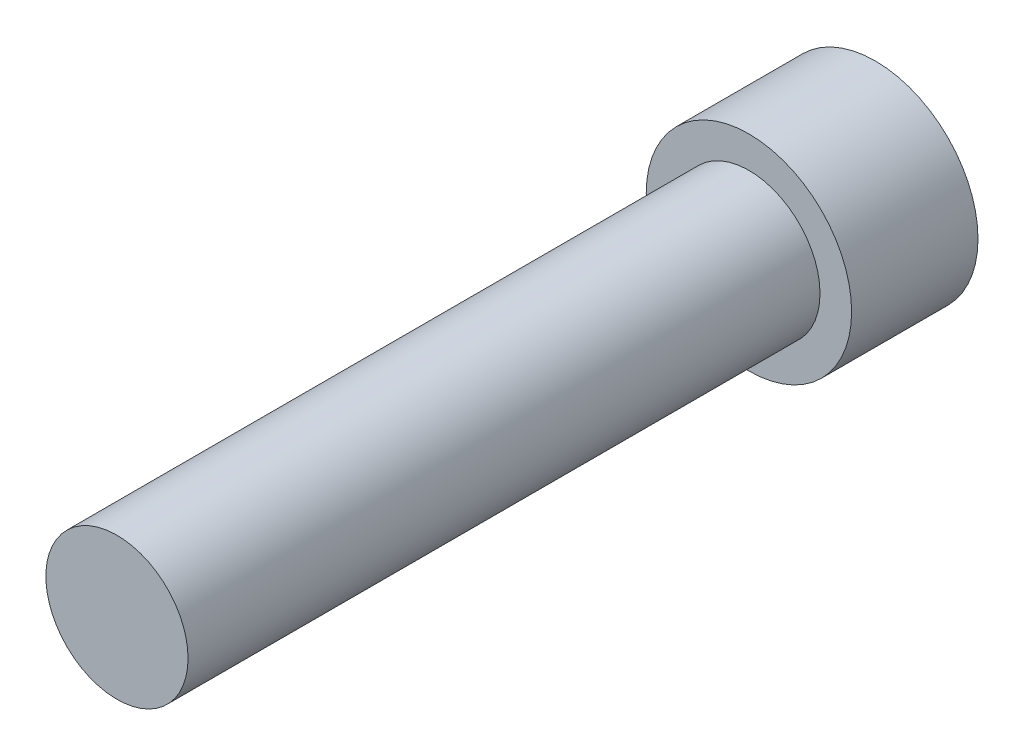
ISO-10303-21;
HEADER;
FILE_DESCRIPTION(('STEP AP214'),'2;1');
FILE_NAME('part.step','',(''),(''),'','','');
FILE_SCHEMA(('AUTOMOTIVE_DESIGN { 1 0 10303 214 1 1 1 1 }'));
ENDSEC;
DATA;
#1=APPLICATION_CONTEXT('core data for automotive mechanical design processes');
#2=APPLICATION_PROTOCOL_DEFINITION('international standard','automotive_design',2000,#1);
#3=PRODUCT_CONTEXT('',#1,'mechanical');
#4=PRODUCT('Part','Part','',(#3));
#5=PRODUCT_RELATED_PRODUCT_CATEGORY('part','',(#4));
#6=PRODUCT_DEFINITION_FORMATION('','',#4);
#7=PRODUCT_DEFINITION_CONTEXT('part definition',#1,'design');
#8=PRODUCT_DEFINITION('design','',#6,#7);
#9=PRODUCT_DEFINITION_SHAPE('','',#8);
#10=(LENGTH_UNIT() NAMED_UNIT(*) SI_UNIT(.MILLI.,.METRE.));
#11=(NAMED_UNIT(*) PLANE_ANGLE_UNIT() SI_UNIT($,.RADIAN.));
#12=(NAMED_UNIT(*) SI_UNIT($,.STERADIAN.) SOLID_ANGLE_UNIT());
#13=UNCERTAINTY_MEASURE_WITH_UNIT(LENGTH_MEASURE(1.E-05),#10,'distance_accuracy_value','');
#14=(GEOMETRIC_REPRESENTATION_CONTEXT(3) GLOBAL_UNCERTAINTY_ASSIGNED_CONTEXT((#13)) GLOBAL_UNIT_ASSIGNED_CONTEXT((#10,
#11,#12)) REPRESENTATION_CONTEXT('',''));
#15=CARTESIAN_POINT('',(0.,0.,0.));
#16=DIRECTION('',(0.,0.,1.));
#17=DIRECTION('',(1.,0.,0.));
#18=AXIS2_PLACEMENT_3D('',#15,#16,#17);
#19=CARTESIAN_POINT('',(0.,0.,40.));
#20=DIRECTION('',(0.,0.,-1.));
#21=DIRECTION('',(-1.,0.,0.));
#22=AXIS2_PLACEMENT_3D('',#19,#20,#21);
#23=CYLINDRICAL_SURFACE('',#22,4.5);
#24=CARTESIAN_POINT('',(0.,0.,40.));
#25=DIRECTION('',(0.,0.,1.));
#26=DIRECTION('',(1.,0.,0.));
#27=AXIS2_PLACEMENT_3D('',#24,#25,#26);
#28=CIRCLE('',#27,4.5);
#29=CARTESIAN_POINT('',(4.5,0.,40.));
#30=VERTEX_POINT('',#29);
#31=EDGE_CURVE('E11',#30,#30,#28,.T.);
#32=ORIENTED_EDGE('',*,*,#31,.F.);
#33=EDGE_LOOP('',(#32));
#34=FACE_BOUND('',#33,.T.);
#35=CARTESIAN_POINT('',(0.,0.,0.));
#36=DIRECTION('',(0.,0.,1.));
#37=DIRECTION('',(1.,0.,0.));
#38=AXIS2_PLACEMENT_3D('',#35,#36,#37);
#39=CIRCLE('',#38,4.5);
#40=CARTESIAN_POINT('',(4.5,0.,0.));
#41=VERTEX_POINT('',#40);
#42=EDGE_CURVE('E48',#41,#41,#39,.T.);
#43=ORIENTED_EDGE('',*,*,#42,.T.);
#44=EDGE_LOOP('',(#43));
#45=FACE_BOUND('',#44,.T.);
#46=ADVANCED_FACE('F45',(#34,#45),#23,.T.);
#47=CARTESIAN_POINT('',(0.,0.,40.));
#48=DIRECTION('',(0.,0.,1.));
#49=DIRECTION('',(1.,0.,0.));
#50=AXIS2_PLACEMENT_3D('',#47,#48,#49);
#51=PLANE('',#50);
#52=ORIENTED_EDGE('',*,*,#31,.T.);
#53=EDGE_LOOP('',(#52));
#54=FACE_BOUND('',#53,.T.);
#55=ADVANCED_FACE('F243',(#54),#51,.T.);
#56=CARTESIAN_POINT('',(0.,0.,-8.));
#57=DIRECTION('',(0.,0.,1.));
#58=DIRECTION('',(1.,0.,0.));
#59=AXIS2_PLACEMENT_3D('',#56,#57,#58);
#60=CYLINDRICAL_SURFACE('',#59,6.5);
#61=CARTESIAN_POINT('',(0.,0.,-8.));
#62=DIRECTION('',(0.,0.,-1.));
#63=DIRECTION('',(-1.,0.,0.));
#64=AXIS2_PLACEMENT_3D('',#61,#62,#63);
#65=CIRCLE('',#64,6.5);
#66=CARTESIAN_POINT('',(-6.5,0.,-8.));
#67=VERTEX_POINT('',#66);
#68=EDGE_CURVE('E218',#67,#67,#65,.T.);
#69=ORIENTED_EDGE('',*,*,#68,.F.);
#70=EDGE_LOOP('',(#69));
#71=FACE_BOUND('',#70,.T.);
#72=CARTESIAN_POINT('',(0.,0.,0.));
#73=DIRECTION('',(0.,0.,-1.));
#74=DIRECTION('',(-1.,0.,0.));
#75=AXIS2_PLACEMENT_3D('',#72,#73,#74);
#76=CIRCLE('',#75,6.5);
#77=CARTESIAN_POINT('',(-6.5,0.,0.));
#78=VERTEX_POINT('',#77);
#79=EDGE_CURVE('E200',#78,#78,#76,.T.);
#80=ORIENTED_EDGE('',*,*,#79,.T.);
#81=EDGE_LOOP('',(#80));
#82=FACE_BOUND('',#81,.T.);
#83=ADVANCED_FACE('F224',(#71,#82),#60,.T.);
#84=CARTESIAN_POINT('',(0.,0.,-8.));
#85=DIRECTION('',(0.,0.,-1.));
#86=DIRECTION('',(-1.,0.,0.));
#87=AXIS2_PLACEMENT_3D('',#84,#85,#86);
#88=PLANE('',#87);
#89=CARTESIAN_POINT('',(1.09157532982501,2.03514044543632,-8.));
#90=DIRECTION('',(0.,0.,-1.));
#91=DIRECTION('',(-1.,0.,0.));
#92=AXIS2_PLACEMENT_3D('',#89,#90,#91);
#93=CIRCLE('',#92,0.5);
#94=CARTESIAN_POINT('',(1.07593528841507,2.53489577467724,-8.));
#95=VERTEX_POINT('',#94);
#96=CARTESIAN_POINT('',(1.51655611991933,2.29856278323403,-8.));
#97=VERTEX_POINT('',#96);
#98=EDGE_CURVE('E59',#95,#97,#93,.T.);
#99=ORIENTED_EDGE('',*,*,#98,.F.);
#100=DIRECTION('',(0.99951065848183,0.0312800828198786,0.));
#101=VECTOR('',#100,1.);
#102=CARTESIAN_POINT('',(-1.23233570251446,2.46265751773191,-8.));
#103=LINE('',#102,#101);
#104=CARTESIAN_POINT('',(-1.23233570251446,2.46265751773191,-8.));
#105=VERTEX_POINT('',#104);
#106=EDGE_CURVE('E196',#105,#95,#103,.T.);
#107=ORIENTED_EDGE('',*,*,#106,.F.);
#108=CARTESIAN_POINT('',(-1.21669566110453,1.962902188491,-8.));
#109=DIRECTION('',(0.,0.,-1.));
#110=DIRECTION('',(-1.,0.,0.));
#111=AXIS2_PLACEMENT_3D('',#108,#109,#110);
#112=CIRCLE('',#111,0.5);
#113=CARTESIAN_POINT('',(-1.65731649260879,2.19923517993421,-8.));
#114=VERTEX_POINT('',#113);
#115=EDGE_CURVE('E194',#114,#105,#112,.T.);
#116=ORIENTED_EDGE('',*,*,#115,.F.);
#117=DIRECTION('',(0.472665982886419,0.881241663008516,0.));
#118=VECTOR('',#117,1.);
#119=CARTESIAN_POINT('',(-2.7488918224338,0.164094734497888,-8.));
#120=LINE('',#119,#118);
#121=CARTESIAN_POINT('',(-2.7488918224338,0.164094734497888,-8.));
#122=VERTEX_POINT('',#121);
#123=EDGE_CURVE('E143',#122,#114,#120,.T.);
#124=ORIENTED_EDGE('',*,*,#123,.F.);
#125=CARTESIAN_POINT('',(-2.30827099092954,-0.0722382569453232,-8.));
#126=DIRECTION('',(0.,0.,-1.));
#127=DIRECTION('',(-1.,0.,0.));
#128=AXIS2_PLACEMENT_3D('',#125,#126,#127);
#129=CIRCLE('',#128,0.5);
#130=CARTESIAN_POINT('',(-2.73325178102386,-0.335660594743031,-8.));
#131=VERTEX_POINT('',#130);
#132=EDGE_CURVE('E190',#131,#122,#129,.T.);
#133=ORIENTED_EDGE('',*,*,#132,.F.);
#134=DIRECTION('',(-0.526844675595411,0.849961580188638,0.));
#135=VECTOR('',#134,1.);
#136=CARTESIAN_POINT('',(-1.51655611991933,-2.29856278323403,-8.));
#137=LINE('',#136,#135);
#138=CARTESIAN_POINT('',(-1.51655611991933,-2.29856278323403,-8.));
#139=VERTEX_POINT('',#138);
#140=EDGE_CURVE('E187',#139,#131,#137,.T.);
#141=ORIENTED_EDGE('',*,*,#140,.F.);
#142=CARTESIAN_POINT('',(-1.09157532982501,-2.03514044543632,-8.));
#143=DIRECTION('',(0.,0.,-1.));
#144=DIRECTION('',(1.,0.,0.));
#145=AXIS2_PLACEMENT_3D('',#142,#143,#144);
#146=CIRCLE('',#145,0.5);
#147=CARTESIAN_POINT('',(-1.07593528841507,-2.53489577467724,-8.));
#148=VERTEX_POINT('',#147);
#149=EDGE_CURVE('E184',#148,#139,#146,.T.);
#150=ORIENTED_EDGE('',*,*,#149,.F.);
#151=DIRECTION('',(-0.99951065848183,-0.0312800828198786,0.));
#152=VECTOR('',#151,1.);
#153=CARTESIAN_POINT('',(1.23233570251446,-2.46265751773191,-8.));
#154=LINE('',#153,#152);
#155=CARTESIAN_POINT('',(1.23233570251446,-2.46265751773191,-8.));
#156=VERTEX_POINT('',#155);
#157=EDGE_CURVE('E181',#156,#148,#154,.T.);
#158=ORIENTED_EDGE('',*,*,#157,.F.);
#159=CARTESIAN_POINT('',(1.21669566110453,-1.962902188491,-8.));
#160=DIRECTION('',(0.,0.,-1.));
#161=DIRECTION('',(-1.,0.,0.));
#162=AXIS2_PLACEMENT_3D('',#159,#160,#161);
#163=CIRCLE('',#162,0.5);
#164=CARTESIAN_POINT('',(1.65731649260879,-2.19923517993421,-8.));
#165=VERTEX_POINT('',#164);
#166=EDGE_CURVE('E178',#165,#156,#163,.T.);
#167=ORIENTED_EDGE('',*,*,#166,.F.);
#168=DIRECTION('',(-0.472665982886419,-0.881241663008516,0.));
#169=VECTOR('',#168,1.);
#170=CARTESIAN_POINT('',(2.7488918224338,-0.164094734497889,-8.));
#171=LINE('',#170,#169);
#172=CARTESIAN_POINT('',(2.7488918224338,-0.164094734497889,-8.));
#173=VERTEX_POINT('',#172);
#174=EDGE_CURVE('E175',#173,#165,#171,.T.);
#175=ORIENTED_EDGE('',*,*,#174,.F.);
#176=CARTESIAN_POINT('',(2.30827099092954,0.0722382569453228,-8.));
#177=DIRECTION('',(0.,0.,-1.));
#178=DIRECTION('',(-1.,0.,0.));
#179=AXIS2_PLACEMENT_3D('',#176,#177,#178);
#180=CIRCLE('',#179,0.5);
#181=CARTESIAN_POINT('',(2.73325178102386,0.33566059474303,-8.));
#182=VERTEX_POINT('',#181);
#183=EDGE_CURVE('E172',#182,#173,#180,.T.);
#184=ORIENTED_EDGE('',*,*,#183,.F.);
#185=DIRECTION('',(0.526844675595411,-0.849961580188638,0.));
#186=VECTOR('',#185,1.);
#187=CARTESIAN_POINT('',(1.51655611991933,2.29856278323403,-8.));
#188=LINE('',#187,#186);
#189=EDGE_CURVE('E169',#97,#182,#188,.T.);
#190=ORIENTED_EDGE('',*,*,#189,.F.);
#191=EDGE_LOOP('',(#99,#107,#116,#124,#133,#141,#150,#158,#167,#175,#184,#190));
#192=FACE_BOUND('',#191,.T.);
#193=ORIENTED_EDGE('',*,*,#68,.T.);
#194=EDGE_LOOP('',(#193));
#195=FACE_BOUND('',#194,.T.);
#196=ADVANCED_FACE('F229',(#192,#195),#88,.T.);
#197=CARTESIAN_POINT('',(0.,0.,0.));
#198=DIRECTION('',(0.,0.,-1.));
#199=DIRECTION('',(-1.,0.,0.));
#200=AXIS2_PLACEMENT_3D('',#197,#198,#199);
#201=PLANE('',#200);
#202=ORIENTED_EDGE('',*,*,#42,.F.);
#203=EDGE_LOOP('',(#202));
#204=FACE_BOUND('',#203,.T.);
#205=ORIENTED_EDGE('',*,*,#79,.F.);
#206=EDGE_LOOP('',(#205));
#207=FACE_BOUND('',#206,.T.);
#208=ADVANCED_FACE('F226',(#204,#207),#201,.F.);
#209=CARTESIAN_POINT('',(1.09157532982501,2.03514044543632,-4.));
#210=DIRECTION('',(0.,0.,-1.));
#211=DIRECTION('',(-1.,0.,0.));
#212=AXIS2_PLACEMENT_3D('',#209,#210,#211);
#213=CYLINDRICAL_SURFACE('',#212,0.5);
#214=ORIENTED_EDGE('',*,*,#98,.T.);
#215=DIRECTION('',(0.,0.,-1.));
#216=VECTOR('',#215,1.);
#217=CARTESIAN_POINT('',(1.51655611991933,2.29856278323403,-4.));
#218=LINE('',#217,#216);
#219=CARTESIAN_POINT('',(1.51655611991933,2.29856278323403,-4.));
#220=VERTEX_POINT('',#219);
#221=EDGE_CURVE('E107',#220,#97,#218,.T.);
#222=ORIENTED_EDGE('',*,*,#221,.F.);
#223=CARTESIAN_POINT('',(1.09157532982501,2.03514044543632,-4.));
#224=DIRECTION('',(0.,0.,-1.));
#225=DIRECTION('',(-1.,0.,0.));
#226=AXIS2_PLACEMENT_3D('',#223,#224,#225);
#227=CIRCLE('',#226,0.5);
#228=CARTESIAN_POINT('',(1.07593528841507,2.53489577467724,-4.));
#229=VERTEX_POINT('',#228);
#230=EDGE_CURVE('E198',#229,#220,#227,.T.);
#231=ORIENTED_EDGE('',*,*,#230,.F.);
#232=DIRECTION('',(0.,0.,-1.));
#233=VECTOR('',#232,1.);
#234=CARTESIAN_POINT('',(1.07593528841507,2.53489577467724,-4.));
#235=LINE('',#234,#233);
#236=EDGE_CURVE('E67',#229,#95,#235,.T.);
#237=ORIENTED_EDGE('',*,*,#236,.T.);
#238=EDGE_LOOP('',(#214,#222,#231,#237));
#239=FACE_BOUND('',#238,.T.);
#240=ADVANCED_FACE('F228',(#239),#213,.F.);
#241=CARTESIAN_POINT('',(-1.23233570251446,2.46265751773191,-4.));
#242=DIRECTION('',(-0.0312800828198786,0.99951065848183,0.));
#243=DIRECTION('',(-0.99951065848183,-0.0312800828198786,0.));
#244=AXIS2_PLACEMENT_3D('',#241,#242,#243);
#245=PLANE('',#244);
#246=ORIENTED_EDGE('',*,*,#106,.T.);
#247=ORIENTED_EDGE('',*,*,#236,.F.);
#248=DIRECTION('',(0.99951065848183,0.0312800828198786,0.));
#249=VECTOR('',#248,1.);
#250=CARTESIAN_POINT('',(-1.23233570251446,2.46265751773191,-4.));
#251=LINE('',#250,#249);
#252=CARTESIAN_POINT('',(-1.23233570251446,2.46265751773191,-4.));
#253=VERTEX_POINT('',#252);
#254=EDGE_CURVE('E155',#253,#229,#251,.T.);
#255=ORIENTED_EDGE('',*,*,#254,.F.);
#256=DIRECTION('',(0.,0.,-1.));
#257=VECTOR('',#256,1.);
#258=CARTESIAN_POINT('',(-1.23233570251446,2.46265751773191,-4.));
#259=LINE('',#258,#257);
#260=EDGE_CURVE('E147',#253,#105,#259,.T.);
#261=ORIENTED_EDGE('',*,*,#260,.T.);
#262=EDGE_LOOP('',(#246,#247,#255,#261));
#263=FACE_BOUND('',#262,.T.);
#264=ADVANCED_FACE('F236',(#263),#245,.F.);
#265=CARTESIAN_POINT('',(-1.21669566110453,1.962902188491,-4.));
#266=DIRECTION('',(0.,0.,-1.));
#267=DIRECTION('',(-1.,0.,0.));
#268=AXIS2_PLACEMENT_3D('',#265,#266,#267);
#269=CYLINDRICAL_SURFACE('',#268,0.5);
#270=ORIENTED_EDGE('',*,*,#115,.T.);
#271=ORIENTED_EDGE('',*,*,#260,.F.);
#272=CARTESIAN_POINT('',(-1.21669566110453,1.962902188491,-4.));
#273=DIRECTION('',(0.,0.,-1.));
#274=DIRECTION('',(-1.,0.,0.));
#275=AXIS2_PLACEMENT_3D('',#272,#273,#274);
#276=CIRCLE('',#275,0.5);
#277=CARTESIAN_POINT('',(-1.65731649260879,2.19923517993421,-4.));
#278=VERTEX_POINT('',#277);
#279=EDGE_CURVE('E151',#278,#253,#276,.T.);
#280=ORIENTED_EDGE('',*,*,#279,.F.);
#281=DIRECTION('',(0.,0.,-1.));
#282=VECTOR('',#281,1.);
#283=CARTESIAN_POINT('',(-1.65731649260879,2.19923517993421,-4.));
#284=LINE('',#283,#282);
#285=EDGE_CURVE('E136',#278,#114,#284,.T.);
#286=ORIENTED_EDGE('',*,*,#285,.T.);
#287=EDGE_LOOP('',(#270,#271,#280,#286));
#288=FACE_BOUND('',#287,.T.);
#289=ADVANCED_FACE('F152',(#288),#269,.F.);
#290=CARTESIAN_POINT('',(-2.7488918224338,0.164094734497888,-4.));
#291=DIRECTION('',(-0.881241663008516,0.472665982886419,0.));
#292=DIRECTION('',(-0.472665982886419,-0.881241663008516,0.));
#293=AXIS2_PLACEMENT_3D('',#290,#291,#292);
#294=PLANE('',#293);
#295=ORIENTED_EDGE('',*,*,#123,.T.);
#296=ORIENTED_EDGE('',*,*,#285,.F.);
#297=DIRECTION('',(0.472665982886419,0.881241663008516,0.));
#298=VECTOR('',#297,1.);
#299=CARTESIAN_POINT('',(-2.7488918224338,0.164094734497888,-4.));
#300=LINE('',#299,#298);
#301=CARTESIAN_POINT('',(-2.7488918224338,0.164094734497888,-4.));
#302=VERTEX_POINT('',#301);
#303=EDGE_CURVE('E140',#302,#278,#300,.T.);
#304=ORIENTED_EDGE('',*,*,#303,.F.);
#305=DIRECTION('',(0.,0.,-1.));
#306=VECTOR('',#305,1.);
#307=CARTESIAN_POINT('',(-2.7488918224338,0.164094734497888,-4.));
#308=LINE('',#307,#306);
#309=EDGE_CURVE('E148',#302,#122,#308,.T.);
#310=ORIENTED_EDGE('',*,*,#309,.T.);
#311=EDGE_LOOP('',(#295,#296,#304,#310));
#312=FACE_BOUND('',#311,.T.);
#313=ADVANCED_FACE('F138',(#312),#294,.F.);
#314=CARTESIAN_POINT('',(-2.30827099092954,-0.0722382569453232,-4.));
#315=DIRECTION('',(0.,0.,-1.));
#316=DIRECTION('',(-1.,0.,0.));
#317=AXIS2_PLACEMENT_3D('',#314,#315,#316);
#318=CYLINDRICAL_SURFACE('',#317,0.5);
#319=ORIENTED_EDGE('',*,*,#132,.T.);
#320=ORIENTED_EDGE('',*,*,#309,.F.);
#321=CARTESIAN_POINT('',(-2.30827099092954,-0.0722382569453232,-4.));
#322=DIRECTION('',(0.,0.,-1.));
#323=DIRECTION('',(-1.,0.,0.));
#324=AXIS2_PLACEMENT_3D('',#321,#322,#323);
#325=CIRCLE('',#324,0.5);
#326=CARTESIAN_POINT('',(-2.73325178102386,-0.335660594743031,-4.));
#327=VERTEX_POINT('',#326);
#328=EDGE_CURVE('E161',#327,#302,#325,.T.);
#329=ORIENTED_EDGE('',*,*,#328,.F.);
#330=DIRECTION('',(0.,0.,-1.));
#331=VECTOR('',#330,1.);
#332=CARTESIAN_POINT('',(-2.73325178102386,-0.335660594743031,-4.));
#333=LINE('',#332,#331);
#334=EDGE_CURVE('E203',#327,#131,#333,.T.);
#335=ORIENTED_EDGE('',*,*,#334,.T.);
#336=EDGE_LOOP('',(#319,#320,#329,#335));
#337=FACE_BOUND('',#336,.T.);
#338=ADVANCED_FACE('F287',(#337),#318,.F.);
#339=CARTESIAN_POINT('',(-1.51655611991933,-2.29856278323403,-4.));
#340=DIRECTION('',(-0.849961580188638,-0.526844675595411,0.));
#341=DIRECTION('',(0.526844675595411,-0.849961580188638,0.));
#342=AXIS2_PLACEMENT_3D('',#339,#340,#341);
#343=PLANE('',#342);
#344=ORIENTED_EDGE('',*,*,#140,.T.);
#345=ORIENTED_EDGE('',*,*,#334,.F.);
#346=DIRECTION('',(-0.526844675595411,0.849961580188638,0.));
#347=VECTOR('',#346,1.);
#348=CARTESIAN_POINT('',(-1.51655611991933,-2.29856278323403,-4.));
#349=LINE('',#348,#347);
#350=CARTESIAN_POINT('',(-1.51655611991933,-2.29856278323403,-4.));
#351=VERTEX_POINT('',#350);
#352=EDGE_CURVE('E163',#351,#327,#349,.T.);
#353=ORIENTED_EDGE('',*,*,#352,.F.);
#354=DIRECTION('',(0.,0.,-1.));
#355=VECTOR('',#354,1.);
#356=CARTESIAN_POINT('',(-1.51655611991933,-2.29856278323403,-4.));
#357=LINE('',#356,#355);
#358=EDGE_CURVE('E205',#351,#139,#357,.T.);
#359=ORIENTED_EDGE('',*,*,#358,.T.);
#360=EDGE_LOOP('',(#344,#345,#353,#359));
#361=FACE_BOUND('',#360,.T.);
#362=ADVANCED_FACE('F294',(#361),#343,.F.);
#363=CARTESIAN_POINT('',(-1.09157532982501,-2.03514044543632,-4.));
#364=DIRECTION('',(0.,0.,-1.));
#365=DIRECTION('',(-1.,0.,0.));
#366=AXIS2_PLACEMENT_3D('',#363,#364,#365);
#367=CYLINDRICAL_SURFACE('',#366,0.5);
#368=ORIENTED_EDGE('',*,*,#149,.T.);
#369=ORIENTED_EDGE('',*,*,#358,.F.);
#370=CARTESIAN_POINT('',(-1.09157532982501,-2.03514044543632,-4.));
#371=DIRECTION('',(0.,0.,-1.));
#372=DIRECTION('',(1.,0.,0.));
#373=AXIS2_PLACEMENT_3D('',#370,#371,#372);
#374=CIRCLE('',#373,0.5);
#375=CARTESIAN_POINT('',(-1.07593528841507,-2.53489577467724,-4.));
#376=VERTEX_POINT('',#375);
#377=EDGE_CURVE('E783',#376,#351,#374,.T.);
#378=ORIENTED_EDGE('',*,*,#377,.F.);
#379=DIRECTION('',(0.,0.,-1.));
#380=VECTOR('',#379,1.);
#381=CARTESIAN_POINT('',(-1.07593528841507,-2.53489577467724,-4.));
#382=LINE('',#381,#380);
#383=EDGE_CURVE('E207',#376,#148,#382,.T.);
#384=ORIENTED_EDGE('',*,*,#383,.T.);
#385=EDGE_LOOP('',(#368,#369,#378,#384));
#386=FACE_BOUND('',#385,.T.);
#387=ADVANCED_FACE('F302',(#386),#367,.F.);
#388=CARTESIAN_POINT('',(1.23233570251446,-2.46265751773191,-4.));
#389=DIRECTION('',(0.0312800828198786,-0.99951065848183,0.));
#390=DIRECTION('',(0.99951065848183,0.0312800828198786,0.));
#391=AXIS2_PLACEMENT_3D('',#388,#389,#390);
#392=PLANE('',#391);
#393=ORIENTED_EDGE('',*,*,#157,.T.);
#394=ORIENTED_EDGE('',*,*,#383,.F.);
#395=DIRECTION('',(-0.99951065848183,-0.0312800828198786,0.));
#396=VECTOR('',#395,1.);
#397=CARTESIAN_POINT('',(1.23233570251446,-2.46265751773191,-4.));
#398=LINE('',#397,#396);
#399=CARTESIAN_POINT('',(1.23233570251446,-2.46265751773191,-4.));
#400=VERTEX_POINT('',#399);
#401=EDGE_CURVE('E780',#400,#376,#398,.T.);
#402=ORIENTED_EDGE('',*,*,#401,.F.);
#403=DIRECTION('',(0.,0.,-1.));
#404=VECTOR('',#403,1.);
#405=CARTESIAN_POINT('',(1.23233570251446,-2.46265751773191,-4.));
#406=LINE('',#405,#404);
#407=EDGE_CURVE('E209',#400,#156,#406,.T.);
#408=ORIENTED_EDGE('',*,*,#407,.T.);
#409=EDGE_LOOP('',(#393,#394,#402,#408));
#410=FACE_BOUND('',#409,.T.);
#411=ADVANCED_FACE('F310',(#410),#392,.F.);
#412=CARTESIAN_POINT('',(1.21669566110453,-1.962902188491,-4.));
#413=DIRECTION('',(0.,0.,-1.));
#414=DIRECTION('',(-1.,0.,0.));
#415=AXIS2_PLACEMENT_3D('',#412,#413,#414);
#416=CYLINDRICAL_SURFACE('',#415,0.5);
#417=ORIENTED_EDGE('',*,*,#166,.T.);
#418=ORIENTED_EDGE('',*,*,#407,.F.);
#419=CARTESIAN_POINT('',(1.21669566110453,-1.962902188491,-4.));
#420=DIRECTION('',(0.,0.,-1.));
#421=DIRECTION('',(-1.,0.,0.));
#422=AXIS2_PLACEMENT_3D('',#419,#420,#421);
#423=CIRCLE('',#422,0.5);
#424=CARTESIAN_POINT('',(1.65731649260879,-2.19923517993421,-4.));
#425=VERTEX_POINT('',#424);
#426=EDGE_CURVE('E777',#425,#400,#423,.T.);
#427=ORIENTED_EDGE('',*,*,#426,.F.);
#428=DIRECTION('',(0.,0.,-1.));
#429=VECTOR('',#428,1.);
#430=CARTESIAN_POINT('',(1.65731649260879,-2.19923517993421,-4.));
#431=LINE('',#430,#429);
#432=EDGE_CURVE('E211',#425,#165,#431,.T.);
#433=ORIENTED_EDGE('',*,*,#432,.T.);
#434=EDGE_LOOP('',(#417,#418,#427,#433));
#435=FACE_BOUND('',#434,.T.);
#436=ADVANCED_FACE('F318',(#435),#416,.F.);
#437=CARTESIAN_POINT('',(2.7488918224338,-0.164094734497889,-4.));
#438=DIRECTION('',(0.881241663008516,-0.472665982886419,0.));
#439=DIRECTION('',(0.472665982886419,0.881241663008516,0.));
#440=AXIS2_PLACEMENT_3D('',#437,#438,#439);
#441=PLANE('',#440);
#442=ORIENTED_EDGE('',*,*,#174,.T.);
#443=ORIENTED_EDGE('',*,*,#432,.F.);
#444=DIRECTION('',(-0.472665982886419,-0.881241663008516,0.));
#445=VECTOR('',#444,1.);
#446=CARTESIAN_POINT('',(2.7488918224338,-0.164094734497889,-4.));
#447=LINE('',#446,#445);
#448=CARTESIAN_POINT('',(2.7488918224338,-0.164094734497889,-4.));
#449=VERTEX_POINT('',#448);
#450=EDGE_CURVE('E770',#449,#425,#447,.T.);
#451=ORIENTED_EDGE('',*,*,#450,.F.);
#452=DIRECTION('',(0.,0.,-1.));
#453=VECTOR('',#452,1.);
#454=CARTESIAN_POINT('',(2.7488918224338,-0.164094734497889,-4.));
#455=LINE('',#454,#453);
#456=EDGE_CURVE('E213',#449,#173,#455,.T.);
#457=ORIENTED_EDGE('',*,*,#456,.T.);
#458=EDGE_LOOP('',(#442,#443,#451,#457));
#459=FACE_BOUND('',#458,.T.);
#460=ADVANCED_FACE('F326',(#459),#441,.F.);
#461=CARTESIAN_POINT('',(2.30827099092954,0.0722382569453228,-4.));
#462=DIRECTION('',(0.,0.,-1.));
#463=DIRECTION('',(-1.,0.,0.));
#464=AXIS2_PLACEMENT_3D('',#461,#462,#463);
#465=CYLINDRICAL_SURFACE('',#464,0.5);
#466=ORIENTED_EDGE('',*,*,#183,.T.);
#467=ORIENTED_EDGE('',*,*,#456,.F.);
#468=CARTESIAN_POINT('',(2.30827099092954,0.0722382569453228,-4.));
#469=DIRECTION('',(0.,0.,-1.));
#470=DIRECTION('',(-1.,0.,0.));
#471=AXIS2_PLACEMENT_3D('',#468,#469,#470);
#472=CIRCLE('',#471,0.5);
#473=CARTESIAN_POINT('',(2.73325178102386,0.33566059474303,-4.));
#474=VERTEX_POINT('',#473);
#475=EDGE_CURVE('E767',#474,#449,#472,.T.);
#476=ORIENTED_EDGE('',*,*,#475,.F.);
#477=DIRECTION('',(0.,0.,-1.));
#478=VECTOR('',#477,1.);
#479=CARTESIAN_POINT('',(2.73325178102386,0.33566059474303,-4.));
#480=LINE('',#479,#478);
#481=EDGE_CURVE('E215',#474,#182,#480,.T.);
#482=ORIENTED_EDGE('',*,*,#481,.T.);
#483=EDGE_LOOP('',(#466,#467,#476,#482));
#484=FACE_BOUND('',#483,.T.);
#485=ADVANCED_FACE('F334',(#484),#465,.F.);
#486=CARTESIAN_POINT('',(1.51655611991933,2.29856278323403,-4.));
#487=DIRECTION('',(0.849961580188638,0.526844675595411,0.));
#488=DIRECTION('',(-0.526844675595411,0.849961580188638,0.));
#489=AXIS2_PLACEMENT_3D('',#486,#487,#488);
#490=PLANE('',#489);
#491=ORIENTED_EDGE('',*,*,#189,.T.);
#492=ORIENTED_EDGE('',*,*,#481,.F.);
#493=DIRECTION('',(0.526844675595411,-0.849961580188638,0.));
#494=VECTOR('',#493,1.);
#495=CARTESIAN_POINT('',(1.51655611991933,2.29856278323403,-4.));
#496=LINE('',#495,#494);
#497=EDGE_CURVE('E771',#220,#474,#496,.T.);
#498=ORIENTED_EDGE('',*,*,#497,.F.);
#499=ORIENTED_EDGE('',*,*,#221,.T.);
#500=EDGE_LOOP('',(#491,#492,#498,#499));
#501=FACE_BOUND('',#500,.T.);
#502=ADVANCED_FACE('F342',(#501),#490,.F.);
#503=CARTESIAN_POINT('',(1.09157532982501,2.03514044543632,-4.));
#504=DIRECTION('',(0.,0.,-1.));
#505=DIRECTION('',(-1.,0.,0.));
#506=AXIS2_PLACEMENT_3D('',#503,#504,#505);
#507=PLANE('',#506);
#508=ORIENTED_EDGE('',*,*,#230,.T.);
#509=ORIENTED_EDGE('',*,*,#497,.T.);
#510=ORIENTED_EDGE('',*,*,#475,.T.);
#511=ORIENTED_EDGE('',*,*,#450,.T.);
#512=ORIENTED_EDGE('',*,*,#426,.T.);
#513=ORIENTED_EDGE('',*,*,#401,.T.);
#514=ORIENTED_EDGE('',*,*,#377,.T.);
#515=ORIENTED_EDGE('',*,*,#352,.T.);
#516=ORIENTED_EDGE('',*,*,#328,.T.);
#517=ORIENTED_EDGE('',*,*,#303,.T.);
#518=ORIENTED_EDGE('',*,*,#279,.T.);
#519=ORIENTED_EDGE('',*,*,#254,.T.);
#520=EDGE_LOOP('',(#508,#509,#510,#511,#512,#513,#514,#515,#516,#517,#518,#519));
#521=FACE_BOUND('',#520,.T.);
#522=ADVANCED_FACE('F158',(#521),#507,.T.);
#523=CLOSED_SHELL('',(#46,#55,#83,#196,#208,#240,#264,#289,#313,#338,#362,#387,#411,#436,#460,
#485,#502,#522));
#524=MANIFOLD_SOLID_BREP('B2',#523);
#525=ADVANCED_BREP_SHAPE_REPRESENTATION('',(#18,#524),#14);
#526=SHAPE_DEFINITION_REPRESENTATION(#9,#525);
ENDSEC;
END-ISO-10303-21;
